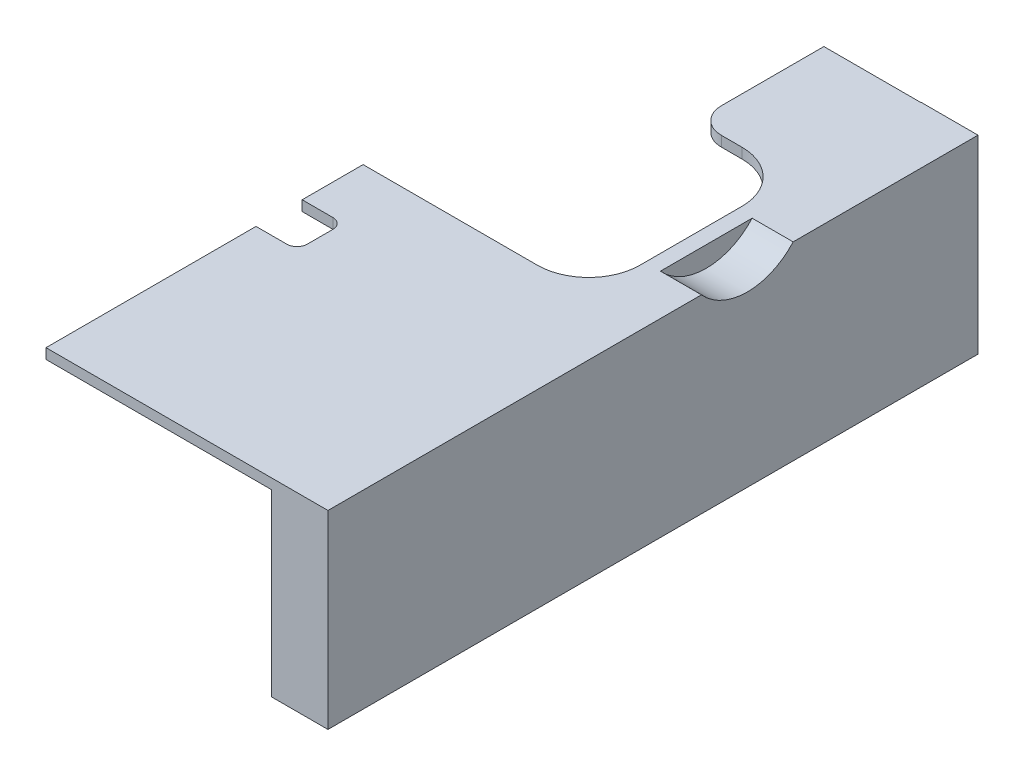
ISO-10303-21;
HEADER;
FILE_DESCRIPTION(('STEP AP214'),'2;1');
FILE_NAME('part.step','',(''),(''),'','','');
FILE_SCHEMA(('AUTOMOTIVE_DESIGN { 1 0 10303 214 1 1 1 1 }'));
ENDSEC;
DATA;
#1=APPLICATION_CONTEXT('core data for automotive mechanical design processes');
#2=APPLICATION_PROTOCOL_DEFINITION('international standard','automotive_design',2000,#1);
#3=PRODUCT_CONTEXT('',#1,'mechanical');
#4=PRODUCT('Part','Part','',(#3));
#5=PRODUCT_RELATED_PRODUCT_CATEGORY('part','',(#4));
#6=PRODUCT_DEFINITION_FORMATION('','',#4);
#7=PRODUCT_DEFINITION_CONTEXT('part definition',#1,'design');
#8=PRODUCT_DEFINITION('design','',#6,#7);
#9=PRODUCT_DEFINITION_SHAPE('','',#8);
#10=(LENGTH_UNIT() NAMED_UNIT(*) SI_UNIT(.MILLI.,.METRE.));
#11=(NAMED_UNIT(*) PLANE_ANGLE_UNIT() SI_UNIT($,.RADIAN.));
#12=(NAMED_UNIT(*) SI_UNIT($,.STERADIAN.) SOLID_ANGLE_UNIT());
#13=UNCERTAINTY_MEASURE_WITH_UNIT(LENGTH_MEASURE(1.E-05),#10,'distance_accuracy_value','');
#14=(GEOMETRIC_REPRESENTATION_CONTEXT(3) GLOBAL_UNCERTAINTY_ASSIGNED_CONTEXT((#13)) GLOBAL_UNIT_ASSIGNED_CONTEXT((#10,
#11,#12)) REPRESENTATION_CONTEXT('',''));
#15=CARTESIAN_POINT('',(0.,0.,0.));
#16=DIRECTION('',(0.,0.,1.));
#17=DIRECTION('',(1.,0.,0.));
#18=AXIS2_PLACEMENT_3D('',#15,#16,#17);
#19=CARTESIAN_POINT('',(52.5,-65.675657138866,-20.0036958587385));
#20=DIRECTION('',(0.,0.,1.));
#21=DIRECTION('',(1.,0.,0.));
#22=AXIS2_PLACEMENT_3D('',#19,#20,#21);
#23=PLANE('',#22);
#24=DIRECTION('',(1.,0.,0.));
#25=VECTOR('',#24,1.);
#26=CARTESIAN_POINT('',(52.5,-26.5,-20.0036958587385));
#27=LINE('',#26,#25);
#28=CARTESIAN_POINT('',(38.5,-26.5,-20.0036958587385));
#29=VERTEX_POINT('',#28);
#30=CARTESIAN_POINT('',(42.5,-26.5,-20.0036958587385));
#31=VERTEX_POINT('',#30);
#32=EDGE_CURVE('E59',#29,#31,#27,.T.);
#33=ORIENTED_EDGE('',*,*,#32,.F.);
#34=DIRECTION('',(0.,1.,0.));
#35=VECTOR('',#34,1.);
#36=CARTESIAN_POINT('',(38.5,-36.5,-20.0036958587385));
#37=LINE('',#36,#35);
#38=CARTESIAN_POINT('',(38.5,-28.5,-20.0036958587385));
#39=VERTEX_POINT('',#38);
#40=EDGE_CURVE('E11',#29,#39,#37,.F.);
#41=ORIENTED_EDGE('',*,*,#40,.T.);
#42=DIRECTION('',(1.,0.,0.));
#43=VECTOR('',#42,1.);
#44=CARTESIAN_POINT('',(52.5,-28.5,-20.0036958587385));
#45=LINE('',#44,#43);
#46=CARTESIAN_POINT('',(42.5,-28.5,-20.0036958587385));
#47=VERTEX_POINT('',#46);
#48=EDGE_CURVE('E197',#39,#47,#45,.T.);
#49=ORIENTED_EDGE('',*,*,#48,.T.);
#50=DIRECTION('',(0.,1.,0.));
#51=VECTOR('',#50,1.);
#52=CARTESIAN_POINT('',(42.5,-65.675657138866,-20.0036958587385));
#53=LINE('',#52,#51);
#54=EDGE_CURVE('E196',#47,#31,#53,.T.);
#55=ORIENTED_EDGE('',*,*,#54,.T.);
#56=EDGE_LOOP('',(#33,#41,#49,#55));
#57=FACE_BOUND('',#56,.T.);
#58=ADVANCED_FACE('F37',(#57),#23,.T.);
#59=CARTESIAN_POINT('',(52.5,-23.5,-45.0594239487394));
#60=DIRECTION('',(0.,0.,-1.));
#61=DIRECTION('',(-1.,0.,0.));
#62=AXIS2_PLACEMENT_3D('',#59,#60,#61);
#63=PLANE('',#62);
#64=DIRECTION('',(-1.,0.,0.));
#65=VECTOR('',#64,1.);
#66=CARTESIAN_POINT('',(52.5,-26.5,-45.0594239487394));
#67=LINE('',#66,#65);
#68=CARTESIAN_POINT('',(63.5,-26.5,-45.0594239487394));
#69=VERTEX_POINT('',#68);
#70=CARTESIAN_POINT('',(52.5,-26.5,-45.0594239487394));
#71=VERTEX_POINT('',#70);
#72=EDGE_CURVE('E260',#69,#71,#67,.T.);
#73=ORIENTED_EDGE('',*,*,#72,.F.);
#74=DIRECTION('',(0.,1.,0.));
#75=VECTOR('',#74,1.);
#76=CARTESIAN_POINT('',(63.5,-23.5,-45.0594239487394));
#77=LINE('',#76,#75);
#78=CARTESIAN_POINT('',(63.5,-63.5,-45.0594239487394));
#79=VERTEX_POINT('',#78);
#80=EDGE_CURVE('E280',#79,#69,#77,.T.);
#81=ORIENTED_EDGE('',*,*,#80,.F.);
#82=DIRECTION('',(1.,0.,0.));
#83=VECTOR('',#82,1.);
#84=CARTESIAN_POINT('',(52.5,-63.5,-45.0594239487394));
#85=LINE('',#84,#83);
#86=CARTESIAN_POINT('',(52.5,-63.5,-45.0594239487394));
#87=VERTEX_POINT('',#86);
#88=EDGE_CURVE('E274',#87,#79,#85,.T.);
#89=ORIENTED_EDGE('',*,*,#88,.F.);
#90=DIRECTION('',(0.,1.,0.));
#91=VECTOR('',#90,1.);
#92=CARTESIAN_POINT('',(52.5,-23.5,-45.0594239487394));
#93=LINE('',#92,#91);
#94=EDGE_CURVE('E285',#87,#71,#93,.T.);
#95=ORIENTED_EDGE('',*,*,#94,.T.);
#96=EDGE_LOOP('',(#73,#81,#89,#95));
#97=FACE_BOUND('',#96,.T.);
#98=ADVANCED_FACE('F380',(#97),#63,.T.);
#99=CARTESIAN_POINT('',(0.,-28.5,0.));
#100=DIRECTION('',(0.,-1.,0.));
#101=DIRECTION('',(0.,0.,-1.));
#102=AXIS2_PLACEMENT_3D('',#99,#100,#101);
#103=PLANE('',#102);
#104=DIRECTION('',(-1.,0.,0.));
#105=VECTOR('',#104,1.);
#106=CARTESIAN_POINT('',(0.,-28.5,19.8848479612598));
#107=LINE('',#106,#105);
#108=CARTESIAN_POINT('',(42.5,-28.5,19.8848479612598));
#109=VERTEX_POINT('',#108);
#110=CARTESIAN_POINT('',(8.5,-28.5,19.8848479612598));
#111=VERTEX_POINT('',#110);
#112=EDGE_CURVE('E198',#109,#111,#107,.T.);
#113=ORIENTED_EDGE('',*,*,#112,.F.);
#114=CARTESIAN_POINT('',(42.5,-28.5,9.88484796125981));
#115=DIRECTION('',(0.,-1.,0.));
#116=DIRECTION('',(0.,0.,-1.));
#117=AXIS2_PLACEMENT_3D('',#114,#115,#116);
#118=CIRCLE('',#117,10.);
#119=CARTESIAN_POINT('',(52.5,-28.5,9.88484796125981));
#120=VERTEX_POINT('',#119);
#121=EDGE_CURVE('E329',#109,#120,#118,.F.);
#122=ORIENTED_EDGE('',*,*,#121,.T.);
#123=DIRECTION('',(0.,0.,-1.));
#124=VECTOR('',#123,1.);
#125=CARTESIAN_POINT('',(52.5,-28.5,0.));
#126=LINE('',#125,#124);
#127=CARTESIAN_POINT('',(52.5,-28.5,81.7371530385704));
#128=VERTEX_POINT('',#127);
#129=EDGE_CURVE('E300',#128,#120,#126,.T.);
#130=ORIENTED_EDGE('',*,*,#129,.F.);
#131=DIRECTION('',(1.,0.,0.));
#132=VECTOR('',#131,1.);
#133=CARTESIAN_POINT('',(57.5,-28.5,81.7371530385704));
#134=LINE('',#133,#132);
#135=CARTESIAN_POINT('',(8.5,-28.5,81.7371530385704));
#136=VERTEX_POINT('',#135);
#137=EDGE_CURVE('E294',#136,#128,#134,.T.);
#138=ORIENTED_EDGE('',*,*,#137,.F.);
#139=DIRECTION('',(0.,0.,-1.));
#140=VECTOR('',#139,1.);
#141=CARTESIAN_POINT('',(8.5,-28.5,0.));
#142=LINE('',#141,#140);
#143=CARTESIAN_POINT('',(8.5,-28.5,40.7691840241398));
#144=VERTEX_POINT('',#143);
#145=EDGE_CURVE('E398',#136,#144,#142,.T.);
#146=ORIENTED_EDGE('',*,*,#145,.T.);
#147=DIRECTION('',(1.,0.,0.));
#148=VECTOR('',#147,1.);
#149=CARTESIAN_POINT('',(0.,-28.5,40.7691840241398));
#150=LINE('',#149,#148);
#151=CARTESIAN_POINT('',(14.5,-28.5,40.7691840241398));
#152=VERTEX_POINT('',#151);
#153=EDGE_CURVE('E303',#144,#152,#150,.T.);
#154=ORIENTED_EDGE('',*,*,#153,.T.);
#155=CARTESIAN_POINT('',(14.5,-28.5,38.7691840241398));
#156=DIRECTION('',(0.,-1.,0.));
#157=DIRECTION('',(0.,0.,-1.));
#158=AXIS2_PLACEMENT_3D('',#155,#156,#157);
#159=CIRCLE('',#158,2.);
#160=CARTESIAN_POINT('',(16.5,-28.5,38.7691840241398));
#161=VERTEX_POINT('',#160);
#162=EDGE_CURVE('E218',#161,#152,#159,.T.);
#163=ORIENTED_EDGE('',*,*,#162,.F.);
#164=DIRECTION('',(0.,0.,1.));
#165=VECTOR('',#164,1.);
#166=CARTESIAN_POINT('',(16.5,-28.5,0.));
#167=LINE('',#166,#165);
#168=CARTESIAN_POINT('',(16.5,-28.5,33.7691840241398));
#169=VERTEX_POINT('',#168);
#170=EDGE_CURVE('E227',#169,#161,#167,.T.);
#171=ORIENTED_EDGE('',*,*,#170,.F.);
#172=CARTESIAN_POINT('',(14.5,-28.5,33.7691840241398));
#173=DIRECTION('',(0.,-1.,0.));
#174=DIRECTION('',(0.,0.,-1.));
#175=AXIS2_PLACEMENT_3D('',#172,#173,#174);
#176=CIRCLE('',#175,2.);
#177=CARTESIAN_POINT('',(14.5,-28.5,31.7691840241398));
#178=VERTEX_POINT('',#177);
#179=EDGE_CURVE('E229',#178,#169,#176,.T.);
#180=ORIENTED_EDGE('',*,*,#179,.F.);
#181=DIRECTION('',(1.,0.,0.));
#182=VECTOR('',#181,1.);
#183=CARTESIAN_POINT('',(0.,-28.5,31.7691840241398));
#184=LINE('',#183,#182);
#185=CARTESIAN_POINT('',(8.5,-28.5,31.7691840241398));
#186=VERTEX_POINT('',#185);
#187=EDGE_CURVE('E237',#186,#178,#184,.T.);
#188=ORIENTED_EDGE('',*,*,#187,.F.);
#189=DIRECTION('',(0.,0.,1.));
#190=VECTOR('',#189,1.);
#191=CARTESIAN_POINT('',(8.5,-28.5,0.));
#192=LINE('',#191,#190);
#193=EDGE_CURVE('E309',#111,#186,#192,.T.);
#194=ORIENTED_EDGE('',*,*,#193,.F.);
#195=EDGE_LOOP('',(#113,#122,#130,#138,#146,#154,#163,#171,#180,#188,#194));
#196=FACE_BOUND('',#195,.T.);
#197=ADVANCED_FACE('F397',(#196),#103,.T.);
#198=CARTESIAN_POINT('',(57.5,-23.5,-45.));
#199=DIRECTION('',(0.,0.,-1.));
#200=DIRECTION('',(-1.,0.,0.));
#201=AXIS2_PLACEMENT_3D('',#198,#199,#200);
#202=PLANE('',#201);
#203=DIRECTION('',(0.,1.,0.));
#204=VECTOR('',#203,1.);
#205=CARTESIAN_POINT('',(33.5,-36.5,-45.));
#206=LINE('',#205,#204);
#207=CARTESIAN_POINT('',(33.5,-28.5,-45.));
#208=VERTEX_POINT('',#207);
#209=CARTESIAN_POINT('',(33.5,-26.5,-45.));
#210=VERTEX_POINT('',#209);
#211=EDGE_CURVE('E364',#208,#210,#206,.T.);
#212=ORIENTED_EDGE('',*,*,#211,.T.);
#213=DIRECTION('',(-1.,0.,0.));
#214=VECTOR('',#213,1.);
#215=CARTESIAN_POINT('',(57.5,-26.5,-45.));
#216=LINE('',#215,#214);
#217=CARTESIAN_POINT('',(52.5,-26.5,-45.));
#218=VERTEX_POINT('',#217);
#219=EDGE_CURVE('E257',#218,#210,#216,.T.);
#220=ORIENTED_EDGE('',*,*,#219,.F.);
#221=DIRECTION('',(0.,-1.,0.));
#222=VECTOR('',#221,1.);
#223=CARTESIAN_POINT('',(52.5,-23.5,-45.));
#224=LINE('',#223,#222);
#225=CARTESIAN_POINT('',(52.5,-28.5,-45.));
#226=VERTEX_POINT('',#225);
#227=EDGE_CURVE('E288',#218,#226,#224,.T.);
#228=ORIENTED_EDGE('',*,*,#227,.T.);
#229=DIRECTION('',(-1.,0.,0.));
#230=VECTOR('',#229,1.);
#231=CARTESIAN_POINT('',(57.5,-28.5,-45.));
#232=LINE('',#231,#230);
#233=EDGE_CURVE('E311',#226,#208,#232,.T.);
#234=ORIENTED_EDGE('',*,*,#233,.T.);
#235=EDGE_LOOP('',(#212,#220,#228,#234));
#236=FACE_BOUND('',#235,.T.);
#237=ADVANCED_FACE('F373',(#236),#202,.T.);
#238=DIRECTION('',(0.,0.,1.));
#239=VECTOR('',#238,1.);
#240=CARTESIAN_POINT('',(33.5,-28.5,0.));
#241=LINE('',#240,#239);
#242=CARTESIAN_POINT('',(33.5,-28.5,-25.0036958587385));
#243=VERTEX_POINT('',#242);
#244=EDGE_CURVE('E359',#208,#243,#241,.T.);
#245=ORIENTED_EDGE('',*,*,#244,.F.);
#246=ORIENTED_EDGE('',*,*,#233,.F.);
#247=DIRECTION('',(0.,0.,1.));
#248=VECTOR('',#247,1.);
#249=CARTESIAN_POINT('',(52.5,-28.5,0.));
#250=LINE('',#249,#248);
#251=CARTESIAN_POINT('',(52.5,-28.5,-10.0036958587385));
#252=VERTEX_POINT('',#251);
#253=EDGE_CURVE('E314',#226,#252,#250,.T.);
#254=ORIENTED_EDGE('',*,*,#253,.T.);
#255=CARTESIAN_POINT('',(42.5,-28.5,-10.0036958587385));
#256=DIRECTION('',(0.,-1.,0.));
#257=DIRECTION('',(0.,0.,-1.));
#258=AXIS2_PLACEMENT_3D('',#255,#256,#257);
#259=CIRCLE('',#258,10.);
#260=EDGE_CURVE('E45',#252,#47,#259,.F.);
#261=ORIENTED_EDGE('',*,*,#260,.T.);
#262=ORIENTED_EDGE('',*,*,#48,.F.);
#263=CARTESIAN_POINT('',(38.5,-28.5,-25.0036958587385));
#264=DIRECTION('',(0.,-1.,0.));
#265=DIRECTION('',(0.,0.,-1.));
#266=AXIS2_PLACEMENT_3D('',#263,#264,#265);
#267=CIRCLE('',#266,5.);
#268=EDGE_CURVE('E52',#243,#39,#267,.F.);
#269=ORIENTED_EDGE('',*,*,#268,.F.);
#270=EDGE_LOOP('',(#245,#246,#254,#261,#262,#269));
#271=FACE_BOUND('',#270,.T.);
#272=ADVANCED_FACE('F337',(#271),#103,.T.);
#273=CARTESIAN_POINT('',(8.5,0.,0.));
#274=DIRECTION('',(-1.,0.,0.));
#275=DIRECTION('',(0.,0.,1.));
#276=AXIS2_PLACEMENT_3D('',#273,#274,#275);
#277=PLANE('',#276);
#278=DIRECTION('',(0.,1.,0.));
#279=VECTOR('',#278,1.);
#280=CARTESIAN_POINT('',(8.5,-36.5,19.8848479612598));
#281=LINE('',#280,#279);
#282=CARTESIAN_POINT('',(8.5,-26.5,19.8848479612598));
#283=VERTEX_POINT('',#282);
#284=EDGE_CURVE('E202',#111,#283,#281,.T.);
#285=ORIENTED_EDGE('',*,*,#284,.F.);
#286=ORIENTED_EDGE('',*,*,#193,.T.);
#287=DIRECTION('',(0.,1.,0.));
#288=VECTOR('',#287,1.);
#289=CARTESIAN_POINT('',(8.5,-34.,31.7691840241398));
#290=LINE('',#289,#288);
#291=CARTESIAN_POINT('',(8.5,-26.5,31.7691840241398));
#292=VERTEX_POINT('',#291);
#293=EDGE_CURVE('E234',#186,#292,#290,.T.);
#294=ORIENTED_EDGE('',*,*,#293,.T.);
#295=DIRECTION('',(0.,0.,1.));
#296=VECTOR('',#295,1.);
#297=CARTESIAN_POINT('',(8.5,-26.5,-66.7628469614296));
#298=LINE('',#297,#296);
#299=EDGE_CURVE('E246',#283,#292,#298,.T.);
#300=ORIENTED_EDGE('',*,*,#299,.F.);
#301=EDGE_LOOP('',(#285,#286,#294,#300));
#302=FACE_BOUND('',#301,.T.);
#303=ADVANCED_FACE('F402',(#302),#277,.T.);
#304=CARTESIAN_POINT('',(0.,-28.5,40.7691840241398));
#305=DIRECTION('',(0.,0.,1.));
#306=DIRECTION('',(1.,0.,0.));
#307=AXIS2_PLACEMENT_3D('',#304,#305,#306);
#308=PLANE('',#307);
#309=DIRECTION('',(0.,-1.,0.));
#310=VECTOR('',#309,1.);
#311=CARTESIAN_POINT('',(8.5,-28.5,40.7691840241398));
#312=LINE('',#311,#310);
#313=CARTESIAN_POINT('',(8.5,-26.5,40.7691840241398));
#314=VERTEX_POINT('',#313);
#315=EDGE_CURVE('E308',#314,#144,#312,.T.);
#316=ORIENTED_EDGE('',*,*,#315,.F.);
#317=DIRECTION('',(1.,0.,0.));
#318=VECTOR('',#317,1.);
#319=CARTESIAN_POINT('',(0.,-26.5,40.7691840241398));
#320=LINE('',#319,#318);
#321=CARTESIAN_POINT('',(14.5,-26.5,40.7691840241398));
#322=VERTEX_POINT('',#321);
#323=EDGE_CURVE('E262',#314,#322,#320,.T.);
#324=ORIENTED_EDGE('',*,*,#323,.T.);
#325=DIRECTION('',(0.,1.,0.));
#326=VECTOR('',#325,1.);
#327=CARTESIAN_POINT('',(14.5,-36.5,40.7691840241398));
#328=LINE('',#327,#326);
#329=EDGE_CURVE('E214',#152,#322,#328,.T.);
#330=ORIENTED_EDGE('',*,*,#329,.F.);
#331=ORIENTED_EDGE('',*,*,#153,.F.);
#332=EDGE_LOOP('',(#316,#324,#330,#331));
#333=FACE_BOUND('',#332,.T.);
#334=ADVANCED_FACE('F425',(#333),#308,.F.);
#335=CARTESIAN_POINT('',(8.5,-26.5,81.7371530385704));
#336=VERTEX_POINT('',#335);
#337=EDGE_CURVE('E241',#314,#336,#298,.T.);
#338=ORIENTED_EDGE('',*,*,#337,.F.);
#339=ORIENTED_EDGE('',*,*,#315,.T.);
#340=ORIENTED_EDGE('',*,*,#145,.F.);
#341=DIRECTION('',(0.,1.,0.));
#342=VECTOR('',#341,1.);
#343=CARTESIAN_POINT('',(8.5,-28.5,81.7371530385704));
#344=LINE('',#343,#342);
#345=EDGE_CURVE('E297',#136,#336,#344,.T.);
#346=ORIENTED_EDGE('',*,*,#345,.T.);
#347=EDGE_LOOP('',(#338,#339,#340,#346));
#348=FACE_BOUND('',#347,.T.);
#349=ADVANCED_FACE('F428',(#348),#277,.T.);
#350=CARTESIAN_POINT('',(57.5,-28.5,81.7371530385704));
#351=DIRECTION('',(0.,0.,1.));
#352=DIRECTION('',(1.,0.,0.));
#353=AXIS2_PLACEMENT_3D('',#350,#351,#352);
#354=PLANE('',#353);
#355=DIRECTION('',(1.,0.,0.));
#356=VECTOR('',#355,1.);
#357=CARTESIAN_POINT('',(8.5,-26.5,81.7371530385704));
#358=LINE('',#357,#356);
#359=CARTESIAN_POINT('',(63.5,-26.5,81.7371530385704));
#360=VERTEX_POINT('',#359);
#361=EDGE_CURVE('E239',#336,#360,#358,.T.);
#362=ORIENTED_EDGE('',*,*,#361,.F.);
#363=ORIENTED_EDGE('',*,*,#345,.F.);
#364=ORIENTED_EDGE('',*,*,#137,.T.);
#365=DIRECTION('',(0.,-1.,0.));
#366=VECTOR('',#365,1.);
#367=CARTESIAN_POINT('',(52.5,-23.5,81.7371530385704));
#368=LINE('',#367,#366);
#369=CARTESIAN_POINT('',(52.5,-63.5,81.7371530385704));
#370=VERTEX_POINT('',#369);
#371=EDGE_CURVE('E282',#128,#370,#368,.T.);
#372=ORIENTED_EDGE('',*,*,#371,.T.);
#373=DIRECTION('',(1.,0.,0.));
#374=VECTOR('',#373,1.);
#375=CARTESIAN_POINT('',(52.5,-63.5,81.7371530385704));
#376=LINE('',#375,#374);
#377=CARTESIAN_POINT('',(63.5,-63.5,81.7371530385704));
#378=VERTEX_POINT('',#377);
#379=EDGE_CURVE('E277',#370,#378,#376,.T.);
#380=ORIENTED_EDGE('',*,*,#379,.T.);
#381=DIRECTION('',(0.,-1.,0.));
#382=VECTOR('',#381,1.);
#383=CARTESIAN_POINT('',(63.5,-23.5,81.7371530385704));
#384=LINE('',#383,#382);
#385=EDGE_CURVE('E292',#360,#378,#384,.T.);
#386=ORIENTED_EDGE('',*,*,#385,.F.);
#387=EDGE_LOOP('',(#362,#363,#364,#372,#380,#386));
#388=FACE_BOUND('',#387,.T.);
#389=ADVANCED_FACE('F392',(#388),#354,.T.);
#390=CARTESIAN_POINT('',(52.5,-23.5,5.));
#391=DIRECTION('',(1.,0.,0.));
#392=DIRECTION('',(0.,0.,-1.));
#393=AXIS2_PLACEMENT_3D('',#390,#391,#392);
#394=PLANE('',#393);
#395=ORIENTED_EDGE('',*,*,#129,.T.);
#396=DIRECTION('',(0.,1.,0.));
#397=VECTOR('',#396,1.);
#398=CARTESIAN_POINT('',(52.5,-26.5,9.88484796125981));
#399=LINE('',#398,#397);
#400=CARTESIAN_POINT('',(52.5,-26.5,9.88484796125981));
#401=VERTEX_POINT('',#400);
#402=EDGE_CURVE('E321',#120,#401,#399,.T.);
#403=ORIENTED_EDGE('',*,*,#402,.T.);
#404=DIRECTION('',(0.,0.,-1.));
#405=VECTOR('',#404,1.);
#406=CARTESIAN_POINT('',(52.5,-26.5,5.));
#407=LINE('',#406,#405);
#408=CARTESIAN_POINT('',(52.5,-26.5,-10.0036958587385));
#409=VERTEX_POINT('',#408);
#410=EDGE_CURVE('E254',#401,#409,#407,.T.);
#411=ORIENTED_EDGE('',*,*,#410,.T.);
#412=DIRECTION('',(0.,1.,0.));
#413=VECTOR('',#412,1.);
#414=CARTESIAN_POINT('',(52.5,-23.5,-10.0036958587385));
#415=LINE('',#414,#413);
#416=EDGE_CURVE('E318',#409,#252,#415,.F.);
#417=ORIENTED_EDGE('',*,*,#416,.T.);
#418=ORIENTED_EDGE('',*,*,#253,.F.);
#419=ORIENTED_EDGE('',*,*,#227,.F.);
#420=EDGE_CURVE('E258',#218,#71,#407,.T.);
#421=ORIENTED_EDGE('',*,*,#420,.T.);
#422=ORIENTED_EDGE('',*,*,#94,.F.);
#423=DIRECTION('',(0.,0.,1.));
#424=VECTOR('',#423,1.);
#425=CARTESIAN_POINT('',(52.5,-63.5,81.7371530385704));
#426=LINE('',#425,#424);
#427=EDGE_CURVE('E271',#87,#370,#426,.T.);
#428=ORIENTED_EDGE('',*,*,#427,.T.);
#429=ORIENTED_EDGE('',*,*,#371,.F.);
#430=EDGE_LOOP('',(#395,#403,#411,#417,#418,#419,#421,#422,#428,#429));
#431=FACE_BOUND('',#430,.T.);
#432=ADVANCED_FACE('F344',(#431),#394,.F.);
#433=CARTESIAN_POINT('',(63.5,-18.5,1.38666652696873));
#434=DIRECTION('',(1.,0.,0.));
#435=DIRECTION('',(0.,0.,-1.));
#436=AXIS2_PLACEMENT_3D('',#433,#434,#435);
#437=PLANE('',#436);
#438=DIRECTION('',(0.,0.,1.));
#439=VECTOR('',#438,1.);
#440=CARTESIAN_POINT('',(63.5,-26.5,-66.7628469614296));
#441=LINE('',#440,#439);
#442=CARTESIAN_POINT('',(63.5,-26.5,8.88484796125981));
#443=VERTEX_POINT('',#442);
#444=EDGE_CURVE('E242',#443,#360,#441,.T.);
#445=ORIENTED_EDGE('',*,*,#444,.T.);
#446=ORIENTED_EDGE('',*,*,#385,.T.);
#447=DIRECTION('',(0.,0.,1.));
#448=VECTOR('',#447,1.);
#449=CARTESIAN_POINT('',(63.5,-63.5,81.7371530385704));
#450=LINE('',#449,#448);
#451=EDGE_CURVE('E268',#79,#378,#450,.T.);
#452=ORIENTED_EDGE('',*,*,#451,.F.);
#453=ORIENTED_EDGE('',*,*,#80,.T.);
#454=CARTESIAN_POINT('',(63.5,-26.5,-9.00369585873851));
#455=VERTEX_POINT('',#454);
#456=EDGE_CURVE('E245',#69,#455,#441,.T.);
#457=ORIENTED_EDGE('',*,*,#456,.T.);
#458=CARTESIAN_POINT('',(63.5,-18.5,-0.0594239487393539));
#459=DIRECTION('',(1.,0.,0.));
#460=DIRECTION('',(0.,0.,-1.));
#461=AXIS2_PLACEMENT_3D('',#458,#459,#460);
#462=CIRCLE('',#461,12.);
#463=EDGE_CURVE('E264',#443,#455,#462,.T.);
#464=ORIENTED_EDGE('',*,*,#463,.F.);
#465=EDGE_LOOP('',(#445,#446,#452,#453,#457,#464));
#466=FACE_BOUND('',#465,.T.);
#467=ADVANCED_FACE('F386',(#466),#437,.T.);
#468=CARTESIAN_POINT('',(52.5,-63.5,81.7371530385704));
#469=DIRECTION('',(0.,1.,0.));
#470=DIRECTION('',(0.,0.,1.));
#471=AXIS2_PLACEMENT_3D('',#468,#469,#470);
#472=PLANE('',#471);
#473=ORIENTED_EDGE('',*,*,#451,.T.);
#474=ORIENTED_EDGE('',*,*,#379,.F.);
#475=ORIENTED_EDGE('',*,*,#427,.F.);
#476=ORIENTED_EDGE('',*,*,#88,.T.);
#477=EDGE_LOOP('',(#473,#474,#475,#476));
#478=FACE_BOUND('',#477,.T.);
#479=ADVANCED_FACE('F384',(#478),#472,.F.);
#480=CARTESIAN_POINT('',(55.5,-18.5,-0.0594239487393539));
#481=DIRECTION('',(1.,0.,0.));
#482=DIRECTION('',(0.,0.,-1.));
#483=AXIS2_PLACEMENT_3D('',#480,#481,#482);
#484=CYLINDRICAL_SURFACE('',#483,12.);
#485=ORIENTED_EDGE('',*,*,#463,.T.);
#486=DIRECTION('',(1.,0.,0.));
#487=VECTOR('',#486,1.);
#488=CARTESIAN_POINT('',(55.5,-26.5,-9.00369585873851));
#489=LINE('',#488,#487);
#490=CARTESIAN_POINT('',(55.5,-26.5,-9.00369585873851));
#491=VERTEX_POINT('',#490);
#492=EDGE_CURVE('E251',#455,#491,#489,.F.);
#493=ORIENTED_EDGE('',*,*,#492,.T.);
#494=CARTESIAN_POINT('',(55.5,-18.5,-0.0594239487393539));
#495=DIRECTION('',(1.,0.,0.));
#496=DIRECTION('',(0.,0.,-1.));
#497=AXIS2_PLACEMENT_3D('',#494,#495,#496);
#498=CIRCLE('',#497,12.);
#499=CARTESIAN_POINT('',(55.5,-26.5,8.8848479612598));
#500=VERTEX_POINT('',#499);
#501=EDGE_CURVE('E265',#500,#491,#498,.T.);
#502=ORIENTED_EDGE('',*,*,#501,.F.);
#503=DIRECTION('',(1.,0.,0.));
#504=VECTOR('',#503,1.);
#505=CARTESIAN_POINT('',(55.5,-26.5,8.8848479612598));
#506=LINE('',#505,#504);
#507=EDGE_CURVE('E248',#500,#443,#506,.T.);
#508=ORIENTED_EDGE('',*,*,#507,.T.);
#509=EDGE_LOOP('',(#485,#493,#502,#508));
#510=FACE_BOUND('',#509,.T.);
#511=ADVANCED_FACE('F464',(#510),#484,.F.);
#512=CARTESIAN_POINT('',(55.5,-18.5,-0.0594239487393539));
#513=DIRECTION('',(1.,0.,0.));
#514=DIRECTION('',(0.,0.,-1.));
#515=AXIS2_PLACEMENT_3D('',#512,#513,#514);
#516=PLANE('',#515);
#517=DIRECTION('',(0.,0.,-1.));
#518=VECTOR('',#517,1.);
#519=CARTESIAN_POINT('',(55.5,-26.5,-0.0594239487393539));
#520=LINE('',#519,#518);
#521=EDGE_CURVE('E316',#500,#491,#520,.T.);
#522=ORIENTED_EDGE('',*,*,#521,.F.);
#523=ORIENTED_EDGE('',*,*,#501,.T.);
#524=EDGE_LOOP('',(#522,#523));
#525=FACE_BOUND('',#524,.T.);
#526=ADVANCED_FACE('F461',(#525),#516,.T.);
#527=CARTESIAN_POINT('',(8.5,-26.5,-66.7628469614296));
#528=DIRECTION('',(0.,-1.,0.));
#529=DIRECTION('',(0.,0.,-1.));
#530=AXIS2_PLACEMENT_3D('',#527,#528,#529);
#531=PLANE('',#530);
#532=ORIENTED_EDGE('',*,*,#219,.T.);
#533=DIRECTION('',(0.,0.,-1.));
#534=VECTOR('',#533,1.);
#535=CARTESIAN_POINT('',(33.5,-26.5,-45.));
#536=LINE('',#535,#534);
#537=CARTESIAN_POINT('',(33.5,-26.5,-25.0036958587385));
#538=VERTEX_POINT('',#537);
#539=EDGE_CURVE('E192',#538,#210,#536,.T.);
#540=ORIENTED_EDGE('',*,*,#539,.F.);
#541=CARTESIAN_POINT('',(38.5,-26.5,-25.0036958587385));
#542=DIRECTION('',(0.,-1.,0.));
#543=DIRECTION('',(0.,0.,-1.));
#544=AXIS2_PLACEMENT_3D('',#541,#542,#543);
#545=CIRCLE('',#544,5.);
#546=EDGE_CURVE('E186',#29,#538,#545,.T.);
#547=ORIENTED_EDGE('',*,*,#546,.F.);
#548=ORIENTED_EDGE('',*,*,#32,.T.);
#549=CARTESIAN_POINT('',(42.5,-26.5,-10.0036958587385));
#550=DIRECTION('',(0.,-1.,0.));
#551=DIRECTION('',(0.,0.,-1.));
#552=AXIS2_PLACEMENT_3D('',#549,#550,#551);
#553=CIRCLE('',#552,10.);
#554=EDGE_CURVE('E332',#31,#409,#553,.T.);
#555=ORIENTED_EDGE('',*,*,#554,.T.);
#556=ORIENTED_EDGE('',*,*,#410,.F.);
#557=CARTESIAN_POINT('',(42.5,-26.5,9.88484796125981));
#558=DIRECTION('',(0.,-1.,0.));
#559=DIRECTION('',(0.,0.,-1.));
#560=AXIS2_PLACEMENT_3D('',#557,#558,#559);
#561=CIRCLE('',#560,10.);
#562=CARTESIAN_POINT('',(42.5,-26.5,19.8848479612598));
#563=VERTEX_POINT('',#562);
#564=EDGE_CURVE('E327',#401,#563,#561,.T.);
#565=ORIENTED_EDGE('',*,*,#564,.T.);
#566=DIRECTION('',(1.,0.,0.));
#567=VECTOR('',#566,1.);
#568=CARTESIAN_POINT('',(52.5,-26.5,19.8848479612598));
#569=LINE('',#568,#567);
#570=EDGE_CURVE('E353',#283,#563,#569,.T.);
#571=ORIENTED_EDGE('',*,*,#570,.F.);
#572=ORIENTED_EDGE('',*,*,#299,.T.);
#573=DIRECTION('',(-1.,0.,0.));
#574=VECTOR('',#573,1.);
#575=CARTESIAN_POINT('',(13.5,-26.5,31.7691840241398));
#576=LINE('',#575,#574);
#577=CARTESIAN_POINT('',(14.5,-26.5,31.7691840241398));
#578=VERTEX_POINT('',#577);
#579=EDGE_CURVE('E231',#578,#292,#576,.T.);
#580=ORIENTED_EDGE('',*,*,#579,.F.);
#581=CARTESIAN_POINT('',(14.5,-26.5,33.7691840241398));
#582=DIRECTION('',(0.,1.,0.));
#583=DIRECTION('',(0.,0.,-1.));
#584=AXIS2_PLACEMENT_3D('',#581,#582,#583);
#585=CIRCLE('',#584,2.);
#586=CARTESIAN_POINT('',(16.5,-26.5,33.7691840241398));
#587=VERTEX_POINT('',#586);
#588=EDGE_CURVE('E211',#587,#578,#585,.T.);
#589=ORIENTED_EDGE('',*,*,#588,.F.);
#590=DIRECTION('',(0.,0.,-1.));
#591=VECTOR('',#590,1.);
#592=CARTESIAN_POINT('',(16.5,-26.5,38.7691840241398));
#593=LINE('',#592,#591);
#594=CARTESIAN_POINT('',(16.5,-26.5,38.7691840241398));
#595=VERTEX_POINT('',#594);
#596=EDGE_CURVE('E208',#595,#587,#593,.T.);
#597=ORIENTED_EDGE('',*,*,#596,.F.);
#598=CARTESIAN_POINT('',(14.5,-26.5,38.7691840241398));
#599=DIRECTION('',(0.,1.,0.));
#600=DIRECTION('',(0.,0.,1.));
#601=AXIS2_PLACEMENT_3D('',#598,#599,#600);
#602=CIRCLE('',#601,2.);
#603=EDGE_CURVE('E200',#322,#595,#602,.T.);
#604=ORIENTED_EDGE('',*,*,#603,.F.);
#605=ORIENTED_EDGE('',*,*,#323,.F.);
#606=ORIENTED_EDGE('',*,*,#337,.T.);
#607=ORIENTED_EDGE('',*,*,#361,.T.);
#608=ORIENTED_EDGE('',*,*,#444,.F.);
#609=ORIENTED_EDGE('',*,*,#507,.F.);
#610=ORIENTED_EDGE('',*,*,#521,.T.);
#611=ORIENTED_EDGE('',*,*,#492,.F.);
#612=ORIENTED_EDGE('',*,*,#456,.F.);
#613=ORIENTED_EDGE('',*,*,#72,.T.);
#614=ORIENTED_EDGE('',*,*,#420,.F.);
#615=EDGE_LOOP('',(#532,#540,#547,#548,#555,#556,#565,#571,#572,#580,#589,#597,#604,#605,#606,
#607,#608,#609,#610,#611,#612,#613,#614));
#616=FACE_BOUND('',#615,.T.);
#617=ADVANCED_FACE('F191',(#616),#531,.F.);
#618=CARTESIAN_POINT('',(13.5,-34.,31.7691840241398));
#619=DIRECTION('',(0.,0.,-1.));
#620=DIRECTION('',(-1.,0.,0.));
#621=AXIS2_PLACEMENT_3D('',#618,#619,#620);
#622=PLANE('',#621);
#623=ORIENTED_EDGE('',*,*,#187,.T.);
#624=DIRECTION('',(0.,1.,0.));
#625=VECTOR('',#624,1.);
#626=CARTESIAN_POINT('',(14.5,-36.5,31.7691840241398));
#627=LINE('',#626,#625);
#628=EDGE_CURVE('E215',#178,#578,#627,.T.);
#629=ORIENTED_EDGE('',*,*,#628,.T.);
#630=ORIENTED_EDGE('',*,*,#579,.T.);
#631=ORIENTED_EDGE('',*,*,#293,.F.);
#632=EDGE_LOOP('',(#623,#629,#630,#631));
#633=FACE_BOUND('',#632,.T.);
#634=ADVANCED_FACE('F406',(#633),#622,.F.);
#635=CARTESIAN_POINT('',(14.5,-36.5,33.7691840241398));
#636=DIRECTION('',(0.,1.,0.));
#637=DIRECTION('',(0.,0.,1.));
#638=AXIS2_PLACEMENT_3D('',#635,#636,#637);
#639=CYLINDRICAL_SURFACE('',#638,2.);
#640=ORIENTED_EDGE('',*,*,#179,.T.);
#641=DIRECTION('',(0.,1.,0.));
#642=VECTOR('',#641,1.);
#643=CARTESIAN_POINT('',(16.5,-36.5,33.7691840241398));
#644=LINE('',#643,#642);
#645=EDGE_CURVE('E219',#169,#587,#644,.T.);
#646=ORIENTED_EDGE('',*,*,#645,.T.);
#647=ORIENTED_EDGE('',*,*,#588,.T.);
#648=ORIENTED_EDGE('',*,*,#628,.F.);
#649=EDGE_LOOP('',(#640,#646,#647,#648));
#650=FACE_BOUND('',#649,.T.);
#651=ADVANCED_FACE('F410',(#650),#639,.F.);
#652=CARTESIAN_POINT('',(16.5,-36.5,38.7691840241398));
#653=DIRECTION('',(1.,0.,0.));
#654=DIRECTION('',(0.,0.,-1.));
#655=AXIS2_PLACEMENT_3D('',#652,#653,#654);
#656=PLANE('',#655);
#657=ORIENTED_EDGE('',*,*,#170,.T.);
#658=DIRECTION('',(0.,1.,0.));
#659=VECTOR('',#658,1.);
#660=CARTESIAN_POINT('',(16.5,-36.5,38.7691840241398));
#661=LINE('',#660,#659);
#662=EDGE_CURVE('E221',#161,#595,#661,.T.);
#663=ORIENTED_EDGE('',*,*,#662,.T.);
#664=ORIENTED_EDGE('',*,*,#596,.T.);
#665=ORIENTED_EDGE('',*,*,#645,.F.);
#666=EDGE_LOOP('',(#657,#663,#664,#665));
#667=FACE_BOUND('',#666,.T.);
#668=ADVANCED_FACE('F415',(#667),#656,.F.);
#669=CARTESIAN_POINT('',(14.5,-36.5,38.7691840241398));
#670=DIRECTION('',(0.,1.,0.));
#671=DIRECTION('',(0.,0.,1.));
#672=AXIS2_PLACEMENT_3D('',#669,#670,#671);
#673=CYLINDRICAL_SURFACE('',#672,2.);
#674=ORIENTED_EDGE('',*,*,#162,.T.);
#675=ORIENTED_EDGE('',*,*,#329,.T.);
#676=ORIENTED_EDGE('',*,*,#603,.T.);
#677=ORIENTED_EDGE('',*,*,#662,.F.);
#678=EDGE_LOOP('',(#674,#675,#676,#677));
#679=FACE_BOUND('',#678,.T.);
#680=ADVANCED_FACE('F420',(#679),#673,.F.);
#681=CARTESIAN_POINT('',(52.5,-36.5,19.8848479612598));
#682=DIRECTION('',(0.,0.,1.));
#683=DIRECTION('',(1.,0.,0.));
#684=AXIS2_PLACEMENT_3D('',#681,#682,#683);
#685=PLANE('',#684);
#686=ORIENTED_EDGE('',*,*,#570,.T.);
#687=DIRECTION('',(0.,1.,0.));
#688=VECTOR('',#687,1.);
#689=CARTESIAN_POINT('',(42.5,-28.5,19.8848479612598));
#690=LINE('',#689,#688);
#691=EDGE_CURVE('E324',#563,#109,#690,.F.);
#692=ORIENTED_EDGE('',*,*,#691,.T.);
#693=ORIENTED_EDGE('',*,*,#112,.T.);
#694=ORIENTED_EDGE('',*,*,#284,.T.);
#695=EDGE_LOOP('',(#686,#692,#693,#694));
#696=FACE_BOUND('',#695,.T.);
#697=ADVANCED_FACE('F356',(#696),#685,.F.);
#698=CARTESIAN_POINT('',(42.5,-23.5,9.88484796125981));
#699=DIRECTION('',(0.,-1.,0.));
#700=DIRECTION('',(0.,0.,-1.));
#701=AXIS2_PLACEMENT_3D('',#698,#699,#700);
#702=CYLINDRICAL_SURFACE('',#701,10.);
#703=ORIENTED_EDGE('',*,*,#121,.F.);
#704=ORIENTED_EDGE('',*,*,#691,.F.);
#705=ORIENTED_EDGE('',*,*,#564,.F.);
#706=ORIENTED_EDGE('',*,*,#402,.F.);
#707=EDGE_LOOP('',(#703,#704,#705,#706));
#708=FACE_BOUND('',#707,.T.);
#709=ADVANCED_FACE('F349',(#708),#702,.F.);
#710=CARTESIAN_POINT('',(42.5,-65.675657138866,-10.0036958587385));
#711=DIRECTION('',(0.,1.,0.));
#712=DIRECTION('',(0.,0.,1.));
#713=AXIS2_PLACEMENT_3D('',#710,#711,#712);
#714=CYLINDRICAL_SURFACE('',#713,10.);
#715=ORIENTED_EDGE('',*,*,#260,.F.);
#716=ORIENTED_EDGE('',*,*,#416,.F.);
#717=ORIENTED_EDGE('',*,*,#554,.F.);
#718=ORIENTED_EDGE('',*,*,#54,.F.);
#719=EDGE_LOOP('',(#715,#716,#717,#718));
#720=FACE_BOUND('',#719,.T.);
#721=ADVANCED_FACE('F39',(#720),#714,.F.);
#722=CARTESIAN_POINT('',(33.5,-36.5,-45.));
#723=DIRECTION('',(1.,0.,0.));
#724=DIRECTION('',(0.,0.,-1.));
#725=AXIS2_PLACEMENT_3D('',#722,#723,#724);
#726=PLANE('',#725);
#727=ORIENTED_EDGE('',*,*,#244,.T.);
#728=DIRECTION('',(0.,1.,0.));
#729=VECTOR('',#728,1.);
#730=CARTESIAN_POINT('',(33.5,-36.5,-25.0036958587385));
#731=LINE('',#730,#729);
#732=EDGE_CURVE('E365',#243,#538,#731,.T.);
#733=ORIENTED_EDGE('',*,*,#732,.T.);
#734=ORIENTED_EDGE('',*,*,#539,.T.);
#735=ORIENTED_EDGE('',*,*,#211,.F.);
#736=EDGE_LOOP('',(#727,#733,#734,#735));
#737=FACE_BOUND('',#736,.T.);
#738=ADVANCED_FACE('F370',(#737),#726,.F.);
#739=CARTESIAN_POINT('',(38.5,-36.5,-25.0036958587385));
#740=DIRECTION('',(0.,1.,0.));
#741=DIRECTION('',(0.,0.,1.));
#742=AXIS2_PLACEMENT_3D('',#739,#740,#741);
#743=CYLINDRICAL_SURFACE('',#742,5.);
#744=ORIENTED_EDGE('',*,*,#268,.T.);
#745=ORIENTED_EDGE('',*,*,#40,.F.);
#746=ORIENTED_EDGE('',*,*,#546,.T.);
#747=ORIENTED_EDGE('',*,*,#732,.F.);
#748=EDGE_LOOP('',(#744,#745,#746,#747));
#749=FACE_BOUND('',#748,.T.);
#750=ADVANCED_FACE('F185',(#749),#743,.T.);
#751=CLOSED_SHELL('',(#58,#98,#197,#237,#272,#303,#334,#349,#389,#432,#467,#479,#511,#526,#617,
#634,#651,#668,#680,#697,#709,#721,#738,#750));
#752=MANIFOLD_SOLID_BREP('B2',#751);
#753=ADVANCED_BREP_SHAPE_REPRESENTATION('',(#18,#752),#14);
#754=SHAPE_DEFINITION_REPRESENTATION(#9,#753);
ENDSEC;
END-ISO-10303-21;
